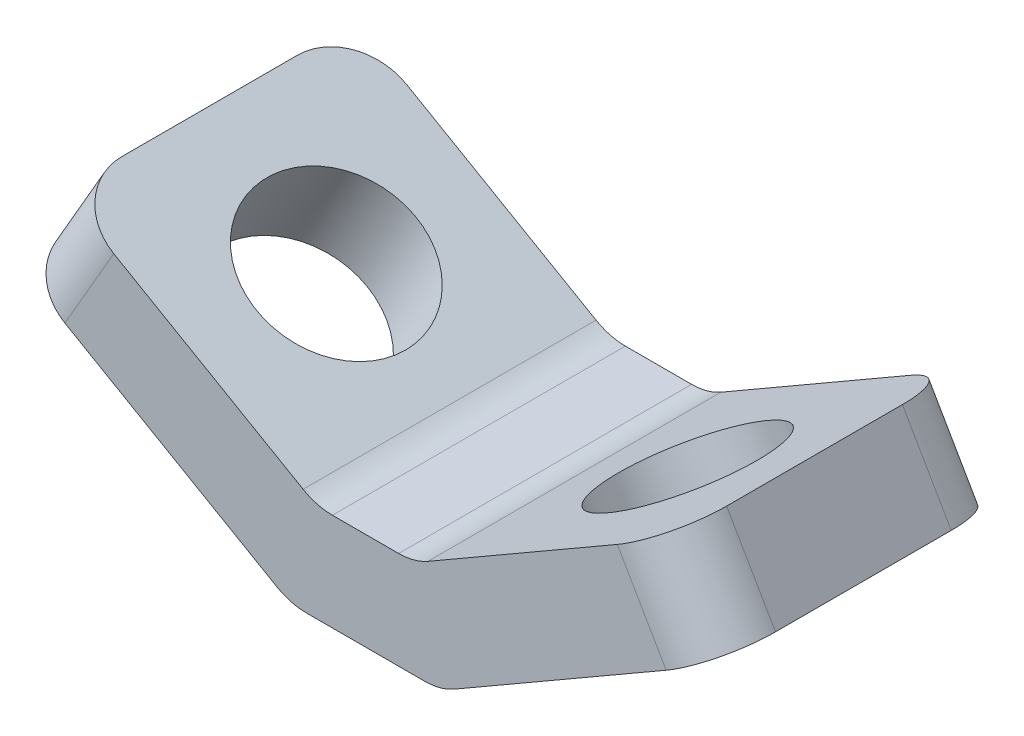
ISO-10303-21;
HEADER;
FILE_DESCRIPTION(('STEP AP214'),'2;1');
FILE_NAME('part.step','',(''),(''),'','','');
FILE_SCHEMA(('AUTOMOTIVE_DESIGN { 1 0 10303 214 1 1 1 1 }'));
ENDSEC;
DATA;
#1=APPLICATION_CONTEXT('core data for automotive mechanical design processes');
#2=APPLICATION_PROTOCOL_DEFINITION('international standard','automotive_design',2000,#1);
#3=PRODUCT_CONTEXT('',#1,'mechanical');
#4=PRODUCT('Part','Part','',(#3));
#5=PRODUCT_RELATED_PRODUCT_CATEGORY('part','',(#4));
#6=PRODUCT_DEFINITION_FORMATION('','',#4);
#7=PRODUCT_DEFINITION_CONTEXT('part definition',#1,'design');
#8=PRODUCT_DEFINITION('design','',#6,#7);
#9=PRODUCT_DEFINITION_SHAPE('','',#8);
#10=(LENGTH_UNIT() NAMED_UNIT(*) SI_UNIT(.MILLI.,.METRE.));
#11=(NAMED_UNIT(*) PLANE_ANGLE_UNIT() SI_UNIT($,.RADIAN.));
#12=(NAMED_UNIT(*) SI_UNIT($,.STERADIAN.) SOLID_ANGLE_UNIT());
#13=UNCERTAINTY_MEASURE_WITH_UNIT(LENGTH_MEASURE(1.E-05),#10,'distance_accuracy_value','');
#14=(GEOMETRIC_REPRESENTATION_CONTEXT(3) GLOBAL_UNCERTAINTY_ASSIGNED_CONTEXT((#13)) GLOBAL_UNIT_ASSIGNED_CONTEXT((#10,
#11,#12)) REPRESENTATION_CONTEXT('',''));
#15=CARTESIAN_POINT('',(0.,0.,0.));
#16=DIRECTION('',(0.,0.,1.));
#17=DIRECTION('',(1.,0.,0.));
#18=AXIS2_PLACEMENT_3D('',#15,#16,#17);
#19=CARTESIAN_POINT('',(7.67949192431122,0.,7.5));
#20=DIRECTION('',(0.,1.,0.));
#21=DIRECTION('',(-1.,0.,0.));
#22=AXIS2_PLACEMENT_3D('',#19,#20,#21);
#23=PLANE('',#22);
#24=DIRECTION('',(1.,0.,0.));
#25=VECTOR('',#24,1.);
#26=CARTESIAN_POINT('',(7.67949192431122,0.,-7.5));
#27=LINE('',#26,#25);
#28=CARTESIAN_POINT('',(0.803847577293372,0.,-7.5));
#29=VERTEX_POINT('',#28);
#30=CARTESIAN_POINT('',(6.87564434701784,0.,-7.5));
#31=VERTEX_POINT('',#30);
#32=EDGE_CURVE('E285',#29,#31,#27,.T.);
#33=ORIENTED_EDGE('',*,*,#32,.T.);
#34=DIRECTION('',(0.,0.,-1.));
#35=VECTOR('',#34,1.);
#36=CARTESIAN_POINT('',(6.87564434701784,0.,7.5));
#37=LINE('',#36,#35);
#38=CARTESIAN_POINT('',(6.87564434701784,0.,7.5));
#39=VERTEX_POINT('',#38);
#40=EDGE_CURVE('E163',#31,#39,#37,.F.);
#41=ORIENTED_EDGE('',*,*,#40,.T.);
#42=DIRECTION('',(1.,0.,0.));
#43=VECTOR('',#42,1.);
#44=CARTESIAN_POINT('',(7.67949192431122,0.,7.5));
#45=LINE('',#44,#43);
#46=CARTESIAN_POINT('',(0.803847577293372,0.,7.5));
#47=VERTEX_POINT('',#46);
#48=EDGE_CURVE('E190',#47,#39,#45,.T.);
#49=ORIENTED_EDGE('',*,*,#48,.F.);
#50=DIRECTION('',(0.,0.,-1.));
#51=VECTOR('',#50,1.);
#52=CARTESIAN_POINT('',(0.80384757729337,0.,7.5));
#53=LINE('',#52,#51);
#54=EDGE_CURVE('E261',#47,#29,#53,.T.);
#55=ORIENTED_EDGE('',*,*,#54,.T.);
#56=EDGE_LOOP('',(#33,#41,#49,#55));
#57=FACE_BOUND('',#56,.T.);
#58=ADVANCED_FACE('F38',(#57),#23,.F.);
#59=CARTESIAN_POINT('',(21.8301270189222,8.16987298107784,7.5));
#60=DIRECTION('',(-0.500000000000001,0.866025403784438,0.));
#61=DIRECTION('',(-0.866025403784438,-0.500000000000001,0.));
#62=AXIS2_PLACEMENT_3D('',#59,#60,#61);
#63=PLANE('',#62);
#64=CARTESIAN_POINT('',(15.3349364905389,4.41987298107783,0.));
#65=DIRECTION('',(-0.500000000000001,0.866025403784438,0.));
#66=DIRECTION('',(-0.866025403784438,-0.500000000000001,0.));
#67=AXIS2_PLACEMENT_3D('',#64,#65,#66);
#68=CIRCLE('',#67,4.1);
#69=CARTESIAN_POINT('',(11.7842323350227,2.36987298107782,0.));
#70=VERTEX_POINT('',#69);
#71=EDGE_CURVE('E207',#70,#70,#68,.T.);
#72=ORIENTED_EDGE('',*,*,#71,.T.);
#73=EDGE_LOOP('',(#72));
#74=FACE_BOUND('',#73,.T.);
#75=DIRECTION('',(0.866025403784438,0.500000000000001,0.));
#76=VECTOR('',#75,1.);
#77=CARTESIAN_POINT('',(21.8301270189222,8.16987298107784,-7.5));
#78=LINE('',#77,#76);
#79=CARTESIAN_POINT('',(8.37564434701785,0.401923788646683,-7.5));
#80=VERTEX_POINT('',#79);
#81=CARTESIAN_POINT('',(19.2320508075689,6.66987298107783,-7.5));
#82=VERTEX_POINT('',#81);
#83=EDGE_CURVE('E184',#80,#82,#78,.T.);
#84=ORIENTED_EDGE('',*,*,#83,.T.);
#85=CARTESIAN_POINT('',(19.2320508075689,6.66987298107783,-4.5));
#86=DIRECTION('',(-0.500000000000001,0.866025403784438,0.));
#87=DIRECTION('',(-0.866025403784438,-0.500000000000001,0.));
#88=AXIS2_PLACEMENT_3D('',#85,#86,#87);
#89=CIRCLE('',#88,3.);
#90=CARTESIAN_POINT('',(21.8301270189222,8.16987298107784,-4.5));
#91=VERTEX_POINT('',#90);
#92=EDGE_CURVE('E241',#82,#91,#89,.F.);
#93=ORIENTED_EDGE('',*,*,#92,.T.);
#94=DIRECTION('',(0.,0.,-1.));
#95=VECTOR('',#94,1.);
#96=CARTESIAN_POINT('',(21.8301270189222,8.16987298107784,7.5));
#97=LINE('',#96,#95);
#98=CARTESIAN_POINT('',(21.8301270189222,8.16987298107784,4.5));
#99=VERTEX_POINT('',#98);
#100=EDGE_CURVE('E200',#99,#91,#97,.T.);
#101=ORIENTED_EDGE('',*,*,#100,.F.);
#102=CARTESIAN_POINT('',(19.2320508075689,6.66987298107783,4.5));
#103=DIRECTION('',(-0.500000000000001,0.866025403784438,0.));
#104=DIRECTION('',(-0.866025403784438,-0.500000000000001,0.));
#105=AXIS2_PLACEMENT_3D('',#102,#103,#104);
#106=CIRCLE('',#105,3.);
#107=CARTESIAN_POINT('',(19.2320508075689,6.66987298107783,7.5));
#108=VERTEX_POINT('',#107);
#109=EDGE_CURVE('E239',#99,#108,#106,.F.);
#110=ORIENTED_EDGE('',*,*,#109,.T.);
#111=DIRECTION('',(0.866025403784438,0.500000000000001,0.));
#112=VECTOR('',#111,1.);
#113=CARTESIAN_POINT('',(21.8301270189222,8.16987298107784,7.5));
#114=LINE('',#113,#112);
#115=CARTESIAN_POINT('',(8.37564434701785,0.401923788646683,7.5));
#116=VERTEX_POINT('',#115);
#117=EDGE_CURVE('E274',#116,#108,#114,.T.);
#118=ORIENTED_EDGE('',*,*,#117,.F.);
#119=DIRECTION('',(0.,0.,-1.));
#120=VECTOR('',#119,1.);
#121=CARTESIAN_POINT('',(8.37564434701785,0.401923788646684,7.5));
#122=LINE('',#121,#120);
#123=EDGE_CURVE('E236',#116,#80,#122,.T.);
#124=ORIENTED_EDGE('',*,*,#123,.T.);
#125=EDGE_LOOP('',(#84,#93,#101,#110,#118,#124));
#126=FACE_BOUND('',#125,.T.);
#127=ADVANCED_FACE('F291',(#74,#126),#63,.F.);
#128=CARTESIAN_POINT('',(19.3301270189222,12.5,7.5));
#129=DIRECTION('',(-0.866025403784438,-0.500000000000002,0.));
#130=DIRECTION('',(0.500000000000002,-0.866025403784438,0.));
#131=AXIS2_PLACEMENT_3D('',#128,#129,#130);
#132=PLANE('',#131);
#133=ORIENTED_EDGE('',*,*,#100,.T.);
#134=DIRECTION('',(-0.500000000000002,0.866025403784438,0.));
#135=VECTOR('',#134,1.);
#136=CARTESIAN_POINT('',(19.3301270189222,12.5,-4.5));
#137=LINE('',#136,#135);
#138=CARTESIAN_POINT('',(19.3301270189222,12.5,-4.5));
#139=VERTEX_POINT('',#138);
#140=EDGE_CURVE('E225',#91,#139,#137,.T.);
#141=ORIENTED_EDGE('',*,*,#140,.T.);
#142=DIRECTION('',(0.,0.,-1.));
#143=VECTOR('',#142,1.);
#144=CARTESIAN_POINT('',(19.3301270189222,12.5,7.5));
#145=LINE('',#144,#143);
#146=CARTESIAN_POINT('',(19.3301270189222,12.5,4.5));
#147=VERTEX_POINT('',#146);
#148=EDGE_CURVE('E197',#147,#139,#145,.T.);
#149=ORIENTED_EDGE('',*,*,#148,.F.);
#150=DIRECTION('',(-0.500000000000002,0.866025403784438,0.));
#151=VECTOR('',#150,1.);
#152=CARTESIAN_POINT('',(19.3301270189222,12.5,4.5));
#153=LINE('',#152,#151);
#154=EDGE_CURVE('E223',#147,#99,#153,.F.);
#155=ORIENTED_EDGE('',*,*,#154,.T.);
#156=EDGE_LOOP('',(#133,#141,#149,#155));
#157=FACE_BOUND('',#156,.T.);
#158=ADVANCED_FACE('F301',(#157),#132,.F.);
#159=CARTESIAN_POINT('',(6.33974596215561,5.,7.5));
#160=DIRECTION('',(0.500000000000002,-0.866025403784437,0.));
#161=DIRECTION('',(0.866025403784438,0.500000000000002,0.));
#162=AXIS2_PLACEMENT_3D('',#159,#160,#161);
#163=PLANE('',#162);
#164=CARTESIAN_POINT('',(12.8349364905389,8.75000000000001,0.));
#165=DIRECTION('',(0.500000000000002,-0.866025403784437,0.));
#166=DIRECTION('',(0.866025403784438,0.500000000000002,0.));
#167=AXIS2_PLACEMENT_3D('',#164,#165,#166);
#168=CIRCLE('',#167,4.1);
#169=CARTESIAN_POINT('',(16.3856406460551,10.8,0.));
#170=VERTEX_POINT('',#169);
#171=EDGE_CURVE('E208',#170,#170,#168,.T.);
#172=ORIENTED_EDGE('',*,*,#171,.T.);
#173=EDGE_LOOP('',(#172));
#174=FACE_BOUND('',#173,.T.);
#175=DIRECTION('',(-0.866025403784438,-0.500000000000002,0.));
#176=VECTOR('',#175,1.);
#177=CARTESIAN_POINT('',(6.33974596215561,5.,-7.5));
#178=LINE('',#177,#176);
#179=CARTESIAN_POINT('',(16.7320508075689,11.,-7.5));
#180=VERTEX_POINT('',#179);
#181=CARTESIAN_POINT('',(7.03589838486225,5.40192378864669,-7.5));
#182=VERTEX_POINT('',#181);
#183=EDGE_CURVE('E179',#180,#182,#178,.T.);
#184=ORIENTED_EDGE('',*,*,#183,.T.);
#185=DIRECTION('',(0.,0.,-1.));
#186=VECTOR('',#185,1.);
#187=CARTESIAN_POINT('',(7.03589838486225,5.40192378864669,7.5));
#188=LINE('',#187,#186);
#189=CARTESIAN_POINT('',(7.03589838486225,5.40192378864669,7.5));
#190=VERTEX_POINT('',#189);
#191=EDGE_CURVE('E157',#182,#190,#188,.F.);
#192=ORIENTED_EDGE('',*,*,#191,.T.);
#193=DIRECTION('',(-0.866025403784438,-0.500000000000002,0.));
#194=VECTOR('',#193,1.);
#195=CARTESIAN_POINT('',(6.33974596215561,5.,7.5));
#196=LINE('',#195,#194);
#197=CARTESIAN_POINT('',(16.7320508075689,11.,7.5));
#198=VERTEX_POINT('',#197);
#199=EDGE_CURVE('E271',#198,#190,#196,.T.);
#200=ORIENTED_EDGE('',*,*,#199,.F.);
#201=CARTESIAN_POINT('',(16.7320508075689,11.,4.5));
#202=DIRECTION('',(0.500000000000002,-0.866025403784437,0.));
#203=DIRECTION('',(0.866025403784438,0.500000000000002,0.));
#204=AXIS2_PLACEMENT_3D('',#201,#202,#203);
#205=CIRCLE('',#204,3.);
#206=EDGE_CURVE('E173',#198,#147,#205,.F.);
#207=ORIENTED_EDGE('',*,*,#206,.T.);
#208=ORIENTED_EDGE('',*,*,#148,.T.);
#209=CARTESIAN_POINT('',(16.7320508075689,11.,-4.5));
#210=DIRECTION('',(0.500000000000002,-0.866025403784437,0.));
#211=DIRECTION('',(0.866025403784438,0.500000000000002,0.));
#212=AXIS2_PLACEMENT_3D('',#209,#210,#211);
#213=CIRCLE('',#212,3.);
#214=EDGE_CURVE('E213',#139,#180,#213,.F.);
#215=ORIENTED_EDGE('',*,*,#214,.T.);
#216=EDGE_LOOP('',(#184,#192,#200,#207,#208,#215));
#217=FACE_BOUND('',#216,.T.);
#218=ADVANCED_FACE('F303',(#174,#217),#163,.F.);
#219=CARTESIAN_POINT('',(1.33974596215561,5.,7.5));
#220=DIRECTION('',(0.,-1.,0.));
#221=DIRECTION('',(1.,0.,0.));
#222=AXIS2_PLACEMENT_3D('',#219,#220,#221);
#223=PLANE('',#222);
#224=DIRECTION('',(-1.,0.,0.));
#225=VECTOR('',#224,1.);
#226=CARTESIAN_POINT('',(1.33974596215561,5.,7.5));
#227=LINE('',#226,#225);
#228=CARTESIAN_POINT('',(5.53589838486224,5.,7.5));
#229=VERTEX_POINT('',#228);
#230=CARTESIAN_POINT('',(2.14359353944898,5.,7.5));
#231=VERTEX_POINT('',#230);
#232=EDGE_CURVE('E172',#229,#231,#227,.T.);
#233=ORIENTED_EDGE('',*,*,#232,.F.);
#234=DIRECTION('',(0.,0.,-1.));
#235=VECTOR('',#234,1.);
#236=CARTESIAN_POINT('',(5.53589838486224,5.,-7.5));
#237=LINE('',#236,#235);
#238=CARTESIAN_POINT('',(5.53589838486224,5.,-7.5));
#239=VERTEX_POINT('',#238);
#240=EDGE_CURVE('E156',#229,#239,#237,.T.);
#241=ORIENTED_EDGE('',*,*,#240,.T.);
#242=DIRECTION('',(-1.,0.,0.));
#243=VECTOR('',#242,1.);
#244=CARTESIAN_POINT('',(1.33974596215561,5.,-7.5));
#245=LINE('',#244,#243);
#246=CARTESIAN_POINT('',(2.14359353944898,5.,-7.5));
#247=VERTEX_POINT('',#246);
#248=EDGE_CURVE('E169',#239,#247,#245,.T.);
#249=ORIENTED_EDGE('',*,*,#248,.T.);
#250=DIRECTION('',(0.,0.,-1.));
#251=VECTOR('',#250,1.);
#252=CARTESIAN_POINT('',(2.14359353944898,5.,7.5));
#253=LINE('',#252,#251);
#254=EDGE_CURVE('E174',#247,#231,#253,.F.);
#255=ORIENTED_EDGE('',*,*,#254,.T.);
#256=EDGE_LOOP('',(#233,#241,#249,#255));
#257=FACE_BOUND('',#256,.T.);
#258=ADVANCED_FACE('F168',(#257),#223,.F.);
#259=CARTESIAN_POINT('',(-11.650635094611,12.5,7.5));
#260=DIRECTION('',(-0.500000000000001,-0.866025403784438,0.));
#261=DIRECTION('',(0.866025403784438,-0.500000000000001,0.));
#262=AXIS2_PLACEMENT_3D('',#259,#260,#261);
#263=PLANE('',#262);
#264=CARTESIAN_POINT('',(-5.15544456622767,8.75000000000001,0.));
#265=DIRECTION('',(-0.500000000000001,-0.866025403784438,0.));
#266=DIRECTION('',(0.866025403784438,-0.500000000000001,0.));
#267=AXIS2_PLACEMENT_3D('',#264,#265,#266);
#268=CIRCLE('',#267,4.1);
#269=CARTESIAN_POINT('',(-1.60474041071148,6.7,0.));
#270=VERTEX_POINT('',#269);
#271=EDGE_CURVE('E206',#270,#270,#268,.T.);
#272=ORIENTED_EDGE('',*,*,#271,.T.);
#273=EDGE_LOOP('',(#272));
#274=FACE_BOUND('',#273,.T.);
#275=DIRECTION('',(-0.866025403784438,0.500000000000001,0.));
#276=VECTOR('',#275,1.);
#277=CARTESIAN_POINT('',(-11.650635094611,12.5,7.5));
#278=LINE('',#277,#276);
#279=CARTESIAN_POINT('',(0.643593539448975,5.40192378864669,7.5));
#280=VERTEX_POINT('',#279);
#281=CARTESIAN_POINT('',(-9.05255888325764,11.,7.5));
#282=VERTEX_POINT('',#281);
#283=EDGE_CURVE('E276',#280,#282,#278,.T.);
#284=ORIENTED_EDGE('',*,*,#283,.F.);
#285=DIRECTION('',(0.,0.,-1.));
#286=VECTOR('',#285,1.);
#287=CARTESIAN_POINT('',(0.643593539448978,5.40192378864669,-7.5));
#288=LINE('',#287,#286);
#289=CARTESIAN_POINT('',(0.643593539448975,5.40192378864669,-7.5));
#290=VERTEX_POINT('',#289);
#291=EDGE_CURVE('E220',#280,#290,#288,.T.);
#292=ORIENTED_EDGE('',*,*,#291,.T.);
#293=DIRECTION('',(-0.866025403784438,0.500000000000001,0.));
#294=VECTOR('',#293,1.);
#295=CARTESIAN_POINT('',(-11.650635094611,12.5,-7.5));
#296=LINE('',#295,#294);
#297=CARTESIAN_POINT('',(-9.05255888325764,11.,-7.5));
#298=VERTEX_POINT('',#297);
#299=EDGE_CURVE('E178',#290,#298,#296,.T.);
#300=ORIENTED_EDGE('',*,*,#299,.T.);
#301=CARTESIAN_POINT('',(-9.05255888325764,11.,-4.5));
#302=DIRECTION('',(-0.500000000000001,-0.866025403784438,0.));
#303=DIRECTION('',(0.866025403784438,-0.500000000000001,0.));
#304=AXIS2_PLACEMENT_3D('',#301,#302,#303);
#305=CIRCLE('',#304,3.);
#306=CARTESIAN_POINT('',(-11.650635094611,12.5,-4.5));
#307=VERTEX_POINT('',#306);
#308=EDGE_CURVE('E218',#298,#307,#305,.F.);
#309=ORIENTED_EDGE('',*,*,#308,.T.);
#310=DIRECTION('',(0.,0.,-1.));
#311=VECTOR('',#310,1.);
#312=CARTESIAN_POINT('',(-11.650635094611,12.5,7.5));
#313=LINE('',#312,#311);
#314=CARTESIAN_POINT('',(-11.650635094611,12.5,4.5));
#315=VERTEX_POINT('',#314);
#316=EDGE_CURVE('E193',#315,#307,#313,.T.);
#317=ORIENTED_EDGE('',*,*,#316,.F.);
#318=CARTESIAN_POINT('',(-9.05255888325764,11.,4.5));
#319=DIRECTION('',(-0.500000000000001,-0.866025403784438,0.));
#320=DIRECTION('',(0.866025403784438,-0.500000000000001,0.));
#321=AXIS2_PLACEMENT_3D('',#318,#319,#320);
#322=CIRCLE('',#321,3.);
#323=EDGE_CURVE('E216',#315,#282,#322,.F.);
#324=ORIENTED_EDGE('',*,*,#323,.T.);
#325=EDGE_LOOP('',(#284,#292,#300,#309,#317,#324));
#326=FACE_BOUND('',#325,.T.);
#327=ADVANCED_FACE('F331',(#274,#326),#263,.F.);
#328=CARTESIAN_POINT('',(-14.150635094611,8.16987298107782,7.5));
#329=DIRECTION('',(0.866025403784438,-0.500000000000001,0.));
#330=DIRECTION('',(0.500000000000001,0.866025403784438,0.));
#331=AXIS2_PLACEMENT_3D('',#328,#329,#330);
#332=PLANE('',#331);
#333=ORIENTED_EDGE('',*,*,#316,.T.);
#334=DIRECTION('',(-0.500000000000001,-0.866025403784438,0.));
#335=VECTOR('',#334,1.);
#336=CARTESIAN_POINT('',(-14.150635094611,8.16987298107782,-4.5));
#337=LINE('',#336,#335);
#338=CARTESIAN_POINT('',(-14.150635094611,8.16987298107782,-4.5));
#339=VERTEX_POINT('',#338);
#340=EDGE_CURVE('E255',#307,#339,#337,.T.);
#341=ORIENTED_EDGE('',*,*,#340,.T.);
#342=DIRECTION('',(0.,0.,-1.));
#343=VECTOR('',#342,1.);
#344=CARTESIAN_POINT('',(-14.150635094611,8.16987298107782,7.5));
#345=LINE('',#344,#343);
#346=CARTESIAN_POINT('',(-14.150635094611,8.16987298107782,4.5));
#347=VERTEX_POINT('',#346);
#348=EDGE_CURVE('E191',#347,#339,#345,.T.);
#349=ORIENTED_EDGE('',*,*,#348,.F.);
#350=DIRECTION('',(-0.500000000000001,-0.866025403784438,0.));
#351=VECTOR('',#350,1.);
#352=CARTESIAN_POINT('',(-14.150635094611,8.16987298107782,4.5));
#353=LINE('',#352,#351);
#354=EDGE_CURVE('E253',#347,#315,#353,.F.);
#355=ORIENTED_EDGE('',*,*,#354,.T.);
#356=EDGE_LOOP('',(#333,#341,#349,#355));
#357=FACE_BOUND('',#356,.T.);
#358=ADVANCED_FACE('F323',(#357),#332,.F.);
#359=CARTESIAN_POINT('',(0.,0.,7.5));
#360=DIRECTION('',(0.500000000000001,0.866025403784438,0.));
#361=DIRECTION('',(-0.866025403784438,0.500000000000001,0.));
#362=AXIS2_PLACEMENT_3D('',#359,#360,#361);
#363=PLANE('',#362);
#364=CARTESIAN_POINT('',(-7.65544456622768,4.41987298107782,0.));
#365=DIRECTION('',(0.500000000000001,0.866025403784438,0.));
#366=DIRECTION('',(-0.866025403784438,0.500000000000001,0.));
#367=AXIS2_PLACEMENT_3D('',#364,#365,#366);
#368=CIRCLE('',#367,4.1);
#369=CARTESIAN_POINT('',(-11.2061487217439,6.46987298107782,0.));
#370=VERTEX_POINT('',#369);
#371=EDGE_CURVE('E203',#370,#370,#368,.T.);
#372=ORIENTED_EDGE('',*,*,#371,.T.);
#373=EDGE_LOOP('',(#372));
#374=FACE_BOUND('',#373,.T.);
#375=ORIENTED_EDGE('',*,*,#348,.T.);
#376=CARTESIAN_POINT('',(-11.5525588832576,6.66987298107782,-4.5));
#377=DIRECTION('',(0.500000000000001,0.866025403784438,0.));
#378=DIRECTION('',(-0.866025403784438,0.500000000000001,0.));
#379=AXIS2_PLACEMENT_3D('',#376,#377,#378);
#380=CIRCLE('',#379,3.);
#381=CARTESIAN_POINT('',(-11.5525588832576,6.66987298107782,-7.5));
#382=VERTEX_POINT('',#381);
#383=EDGE_CURVE('E53',#339,#382,#380,.F.);
#384=ORIENTED_EDGE('',*,*,#383,.T.);
#385=DIRECTION('',(0.866025403784438,-0.500000000000001,0.));
#386=VECTOR('',#385,1.);
#387=CARTESIAN_POINT('',(0.,0.,-7.5));
#388=LINE('',#387,#386);
#389=CARTESIAN_POINT('',(-0.696152422706632,0.401923788646685,-7.5));
#390=VERTEX_POINT('',#389);
#391=EDGE_CURVE('E182',#382,#390,#388,.T.);
#392=ORIENTED_EDGE('',*,*,#391,.T.);
#393=DIRECTION('',(0.,0.,-1.));
#394=VECTOR('',#393,1.);
#395=CARTESIAN_POINT('',(-0.696152422706632,0.401923788646685,7.5));
#396=LINE('',#395,#394);
#397=CARTESIAN_POINT('',(-0.696152422706632,0.401923788646685,7.5));
#398=VERTEX_POINT('',#397);
#399=EDGE_CURVE('E257',#390,#398,#396,.F.);
#400=ORIENTED_EDGE('',*,*,#399,.T.);
#401=DIRECTION('',(0.866025403784438,-0.500000000000001,0.));
#402=VECTOR('',#401,1.);
#403=CARTESIAN_POINT('',(0.,0.,7.5));
#404=LINE('',#403,#402);
#405=CARTESIAN_POINT('',(-11.5525588832576,6.66987298107782,7.5));
#406=VERTEX_POINT('',#405);
#407=EDGE_CURVE('E194',#406,#398,#404,.T.);
#408=ORIENTED_EDGE('',*,*,#407,.F.);
#409=CARTESIAN_POINT('',(-11.5525588832576,6.66987298107782,4.5));
#410=DIRECTION('',(0.500000000000001,0.866025403784438,0.));
#411=DIRECTION('',(-0.866025403784438,0.500000000000001,0.));
#412=AXIS2_PLACEMENT_3D('',#409,#410,#411);
#413=CIRCLE('',#412,3.);
#414=EDGE_CURVE('E61',#406,#347,#413,.F.);
#415=ORIENTED_EDGE('',*,*,#414,.T.);
#416=EDGE_LOOP('',(#375,#384,#392,#400,#408,#415));
#417=FACE_BOUND('',#416,.T.);
#418=ADVANCED_FACE('F320',(#374,#417),#363,.F.);
#419=CARTESIAN_POINT('',(0.,0.,7.5));
#420=DIRECTION('',(0.,0.,-1.));
#421=DIRECTION('',(-1.,0.,0.));
#422=AXIS2_PLACEMENT_3D('',#419,#420,#421);
#423=PLANE('',#422);
#424=ORIENTED_EDGE('',*,*,#117,.T.);
#425=DIRECTION('',(-0.500000000000002,0.866025403784438,0.));
#426=VECTOR('',#425,1.);
#427=CARTESIAN_POINT('',(17.3121778264911,9.99519052838332,7.5));
#428=LINE('',#427,#426);
#429=EDGE_CURVE('E250',#108,#198,#428,.T.);
#430=ORIENTED_EDGE('',*,*,#429,.T.);
#431=ORIENTED_EDGE('',*,*,#199,.T.);
#432=CARTESIAN_POINT('',(5.53589838486224,8.,7.5));
#433=DIRECTION('',(0.,0.,-1.));
#434=DIRECTION('',(-1.,0.,0.));
#435=AXIS2_PLACEMENT_3D('',#432,#433,#434);
#436=CIRCLE('',#435,3.);
#437=EDGE_CURVE('E162',#190,#229,#436,.T.);
#438=ORIENTED_EDGE('',*,*,#437,.T.);
#439=ORIENTED_EDGE('',*,*,#232,.T.);
#440=CARTESIAN_POINT('',(2.14359353944898,8.,7.5));
#441=DIRECTION('',(0.,0.,-1.));
#442=DIRECTION('',(-1.,0.,0.));
#443=AXIS2_PLACEMENT_3D('',#440,#441,#442);
#444=CIRCLE('',#443,3.);
#445=EDGE_CURVE('E11',#231,#280,#444,.T.);
#446=ORIENTED_EDGE('',*,*,#445,.T.);
#447=ORIENTED_EDGE('',*,*,#283,.T.);
#448=DIRECTION('',(-0.500000000000001,-0.866025403784438,0.));
#449=VECTOR('',#448,1.);
#450=CARTESIAN_POINT('',(-11.5525588832576,6.66987298107782,7.5));
#451=LINE('',#450,#449);
#452=EDGE_CURVE('E247',#282,#406,#451,.T.);
#453=ORIENTED_EDGE('',*,*,#452,.T.);
#454=ORIENTED_EDGE('',*,*,#407,.T.);
#455=CARTESIAN_POINT('',(0.80384757729337,3.,7.5));
#456=DIRECTION('',(0.,0.,-1.));
#457=DIRECTION('',(-1.,0.,0.));
#458=AXIS2_PLACEMENT_3D('',#455,#456,#457);
#459=CIRCLE('',#458,3.);
#460=EDGE_CURVE('E243',#398,#47,#459,.F.);
#461=ORIENTED_EDGE('',*,*,#460,.T.);
#462=ORIENTED_EDGE('',*,*,#48,.T.);
#463=CARTESIAN_POINT('',(6.87564434701784,3.,7.5));
#464=DIRECTION('',(0.,0.,-1.));
#465=DIRECTION('',(-1.,0.,0.));
#466=AXIS2_PLACEMENT_3D('',#463,#464,#465);
#467=CIRCLE('',#466,3.);
#468=EDGE_CURVE('E245',#39,#116,#467,.F.);
#469=ORIENTED_EDGE('',*,*,#468,.T.);
#470=EDGE_LOOP('',(#424,#430,#431,#438,#439,#446,#447,#453,#454,#461,#462,#469));
#471=FACE_BOUND('',#470,.T.);
#472=ADVANCED_FACE('F268',(#471),#423,.F.);
#473=CARTESIAN_POINT('',(0.,0.,-7.5));
#474=DIRECTION('',(0.,0.,-1.));
#475=DIRECTION('',(-1.,0.,0.));
#476=AXIS2_PLACEMENT_3D('',#473,#474,#475);
#477=PLANE('',#476);
#478=ORIENTED_EDGE('',*,*,#183,.F.);
#479=DIRECTION('',(-0.500000000000002,0.866025403784438,0.));
#480=VECTOR('',#479,1.);
#481=CARTESIAN_POINT('',(19.2320508075689,6.66987298107783,-7.5));
#482=LINE('',#481,#480);
#483=EDGE_CURVE('E234',#180,#82,#482,.F.);
#484=ORIENTED_EDGE('',*,*,#483,.T.);
#485=ORIENTED_EDGE('',*,*,#83,.F.);
#486=CARTESIAN_POINT('',(6.87564434701784,3.,-7.5));
#487=DIRECTION('',(0.,0.,-1.));
#488=DIRECTION('',(-1.,0.,0.));
#489=AXIS2_PLACEMENT_3D('',#486,#487,#488);
#490=CIRCLE('',#489,3.);
#491=EDGE_CURVE('E230',#80,#31,#490,.T.);
#492=ORIENTED_EDGE('',*,*,#491,.T.);
#493=ORIENTED_EDGE('',*,*,#32,.F.);
#494=CARTESIAN_POINT('',(0.80384757729337,3.,-7.5));
#495=DIRECTION('',(0.,0.,-1.));
#496=DIRECTION('',(-1.,0.,0.));
#497=AXIS2_PLACEMENT_3D('',#494,#495,#496);
#498=CIRCLE('',#497,3.);
#499=EDGE_CURVE('E228',#29,#390,#498,.T.);
#500=ORIENTED_EDGE('',*,*,#499,.T.);
#501=ORIENTED_EDGE('',*,*,#391,.F.);
#502=DIRECTION('',(-0.500000000000001,-0.866025403784438,0.));
#503=VECTOR('',#502,1.);
#504=CARTESIAN_POINT('',(-9.05255888325764,11.,-7.5));
#505=LINE('',#504,#503);
#506=EDGE_CURVE('E232',#382,#298,#505,.F.);
#507=ORIENTED_EDGE('',*,*,#506,.T.);
#508=ORIENTED_EDGE('',*,*,#299,.F.);
#509=CARTESIAN_POINT('',(2.14359353944898,8.,-7.5));
#510=DIRECTION('',(0.,0.,-1.));
#511=DIRECTION('',(-1.,0.,0.));
#512=AXIS2_PLACEMENT_3D('',#509,#510,#511);
#513=CIRCLE('',#512,3.);
#514=EDGE_CURVE('E46',#290,#247,#513,.F.);
#515=ORIENTED_EDGE('',*,*,#514,.T.);
#516=ORIENTED_EDGE('',*,*,#248,.F.);
#517=CARTESIAN_POINT('',(5.53589838486224,8.,-7.5));
#518=DIRECTION('',(0.,0.,-1.));
#519=DIRECTION('',(-1.,0.,0.));
#520=AXIS2_PLACEMENT_3D('',#517,#518,#519);
#521=CIRCLE('',#520,3.);
#522=EDGE_CURVE('E152',#239,#182,#521,.F.);
#523=ORIENTED_EDGE('',*,*,#522,.T.);
#524=EDGE_LOOP('',(#478,#484,#485,#492,#493,#500,#501,#507,#508,#515,#516,#523));
#525=FACE_BOUND('',#524,.T.);
#526=ADVANCED_FACE('F176',(#525),#477,.T.);
#527=CARTESIAN_POINT('',(3.21474596215566,23.2475952641917,0.));
#528=DIRECTION('',(-0.500000000000001,-0.866025403784438,0.));
#529=DIRECTION('',(0.866025403784438,-0.500000000000001,0.));
#530=AXIS2_PLACEMENT_3D('',#527,#528,#529);
#531=CYLINDRICAL_SURFACE('',#530,4.1);
#532=ORIENTED_EDGE('',*,*,#371,.F.);
#533=EDGE_LOOP('',(#532));
#534=FACE_BOUND('',#533,.T.);
#535=ORIENTED_EDGE('',*,*,#271,.F.);
#536=EDGE_LOOP('',(#535));
#537=FACE_BOUND('',#536,.T.);
#538=ADVANCED_FACE('F426',(#534,#537),#531,.F.);
#539=CARTESIAN_POINT('',(4.46474596215556,23.2475952641917,0.));
#540=DIRECTION('',(0.500000000000001,-0.866025403784438,0.));
#541=DIRECTION('',(0.866025403784438,0.500000000000001,0.));
#542=AXIS2_PLACEMENT_3D('',#539,#540,#541);
#543=CYLINDRICAL_SURFACE('',#542,4.1);
#544=ORIENTED_EDGE('',*,*,#171,.F.);
#545=EDGE_LOOP('',(#544));
#546=FACE_BOUND('',#545,.T.);
#547=ORIENTED_EDGE('',*,*,#71,.F.);
#548=EDGE_LOOP('',(#547));
#549=FACE_BOUND('',#548,.T.);
#550=ADVANCED_FACE('F356',(#546,#549),#543,.F.);
#551=CARTESIAN_POINT('',(5.53589838486224,8.,7.5));
#552=DIRECTION('',(0.,0.,1.));
#553=DIRECTION('',(1.,0.,0.));
#554=AXIS2_PLACEMENT_3D('',#551,#552,#553);
#555=CYLINDRICAL_SURFACE('',#554,3.);
#556=ORIENTED_EDGE('',*,*,#437,.F.);
#557=ORIENTED_EDGE('',*,*,#191,.F.);
#558=ORIENTED_EDGE('',*,*,#522,.F.);
#559=ORIENTED_EDGE('',*,*,#240,.F.);
#560=EDGE_LOOP('',(#556,#557,#558,#559));
#561=FACE_BOUND('',#560,.T.);
#562=ADVANCED_FACE('F155',(#561),#555,.F.);
#563=CARTESIAN_POINT('',(2.14359353944898,8.,7.5));
#564=DIRECTION('',(0.,0.,1.));
#565=DIRECTION('',(1.,0.,0.));
#566=AXIS2_PLACEMENT_3D('',#563,#564,#565);
#567=CYLINDRICAL_SURFACE('',#566,3.);
#568=ORIENTED_EDGE('',*,*,#445,.F.);
#569=ORIENTED_EDGE('',*,*,#254,.F.);
#570=ORIENTED_EDGE('',*,*,#514,.F.);
#571=ORIENTED_EDGE('',*,*,#291,.F.);
#572=EDGE_LOOP('',(#568,#569,#570,#571));
#573=FACE_BOUND('',#572,.T.);
#574=ADVANCED_FACE('F334',(#573),#567,.F.);
#575=CARTESIAN_POINT('',(16.7320508075689,11.,-4.5));
#576=DIRECTION('',(0.500000000000002,-0.866025403784438,0.));
#577=DIRECTION('',(0.866025403784438,0.500000000000002,0.));
#578=AXIS2_PLACEMENT_3D('',#575,#576,#577);
#579=CYLINDRICAL_SURFACE('',#578,3.);
#580=ORIENTED_EDGE('',*,*,#92,.F.);
#581=ORIENTED_EDGE('',*,*,#483,.F.);
#582=ORIENTED_EDGE('',*,*,#214,.F.);
#583=ORIENTED_EDGE('',*,*,#140,.F.);
#584=EDGE_LOOP('',(#580,#581,#582,#583));
#585=FACE_BOUND('',#584,.T.);
#586=ADVANCED_FACE('F298',(#585),#579,.T.);
#587=CARTESIAN_POINT('',(17.3121778264911,9.99519052838332,4.5));
#588=DIRECTION('',(-0.500000000000002,0.866025403784438,0.));
#589=DIRECTION('',(-0.866025403784438,-0.500000000000002,0.));
#590=AXIS2_PLACEMENT_3D('',#587,#588,#589);
#591=CYLINDRICAL_SURFACE('',#590,3.);
#592=ORIENTED_EDGE('',*,*,#109,.F.);
#593=ORIENTED_EDGE('',*,*,#154,.F.);
#594=ORIENTED_EDGE('',*,*,#206,.F.);
#595=ORIENTED_EDGE('',*,*,#429,.F.);
#596=EDGE_LOOP('',(#592,#593,#594,#595));
#597=FACE_BOUND('',#596,.T.);
#598=ADVANCED_FACE('F306',(#597),#591,.T.);
#599=CARTESIAN_POINT('',(-11.5525588832576,6.66987298107782,-4.5));
#600=DIRECTION('',(0.500000000000001,0.866025403784438,0.));
#601=DIRECTION('',(-0.866025403784438,0.500000000000001,0.));
#602=AXIS2_PLACEMENT_3D('',#599,#600,#601);
#603=CYLINDRICAL_SURFACE('',#602,3.);
#604=ORIENTED_EDGE('',*,*,#308,.F.);
#605=ORIENTED_EDGE('',*,*,#506,.F.);
#606=ORIENTED_EDGE('',*,*,#383,.F.);
#607=ORIENTED_EDGE('',*,*,#340,.F.);
#608=EDGE_LOOP('',(#604,#605,#606,#607));
#609=FACE_BOUND('',#608,.T.);
#610=ADVANCED_FACE('F336',(#609),#603,.T.);
#611=CARTESIAN_POINT('',(-11.5525588832576,6.66987298107782,4.5));
#612=DIRECTION('',(-0.500000000000001,-0.866025403784438,0.));
#613=DIRECTION('',(0.866025403784438,-0.500000000000001,0.));
#614=AXIS2_PLACEMENT_3D('',#611,#612,#613);
#615=CYLINDRICAL_SURFACE('',#614,3.);
#616=ORIENTED_EDGE('',*,*,#323,.F.);
#617=ORIENTED_EDGE('',*,*,#354,.F.);
#618=ORIENTED_EDGE('',*,*,#414,.F.);
#619=ORIENTED_EDGE('',*,*,#452,.F.);
#620=EDGE_LOOP('',(#616,#617,#618,#619));
#621=FACE_BOUND('',#620,.T.);
#622=ADVANCED_FACE('F327',(#621),#615,.T.);
#623=CARTESIAN_POINT('',(6.87564434701784,3.,7.5));
#624=DIRECTION('',(0.,0.,-1.));
#625=DIRECTION('',(-1.,0.,0.));
#626=AXIS2_PLACEMENT_3D('',#623,#624,#625);
#627=CYLINDRICAL_SURFACE('',#626,3.);
#628=ORIENTED_EDGE('',*,*,#468,.F.);
#629=ORIENTED_EDGE('',*,*,#40,.F.);
#630=ORIENTED_EDGE('',*,*,#491,.F.);
#631=ORIENTED_EDGE('',*,*,#123,.F.);
#632=EDGE_LOOP('',(#628,#629,#630,#631));
#633=FACE_BOUND('',#632,.T.);
#634=ADVANCED_FACE('F312',(#633),#627,.T.);
#635=CARTESIAN_POINT('',(0.80384757729337,3.,7.5));
#636=DIRECTION('',(0.,0.,-1.));
#637=DIRECTION('',(-1.,0.,0.));
#638=AXIS2_PLACEMENT_3D('',#635,#636,#637);
#639=CYLINDRICAL_SURFACE('',#638,3.);
#640=ORIENTED_EDGE('',*,*,#460,.F.);
#641=ORIENTED_EDGE('',*,*,#399,.F.);
#642=ORIENTED_EDGE('',*,*,#499,.F.);
#643=ORIENTED_EDGE('',*,*,#54,.F.);
#644=EDGE_LOOP('',(#640,#641,#642,#643));
#645=FACE_BOUND('',#644,.T.);
#646=ADVANCED_FACE('F40',(#645),#639,.T.);
#647=CLOSED_SHELL('',(#58,#127,#158,#218,#258,#327,#358,#418,#472,#526,#538,#550,#562,#574,#586,
#598,#610,#622,#634,#646));
#648=MANIFOLD_SOLID_BREP('B2',#647);
#649=ADVANCED_BREP_SHAPE_REPRESENTATION('',(#18,#648),#14);
#650=SHAPE_DEFINITION_REPRESENTATION(#9,#649);
ENDSEC;
END-ISO-10303-21;
